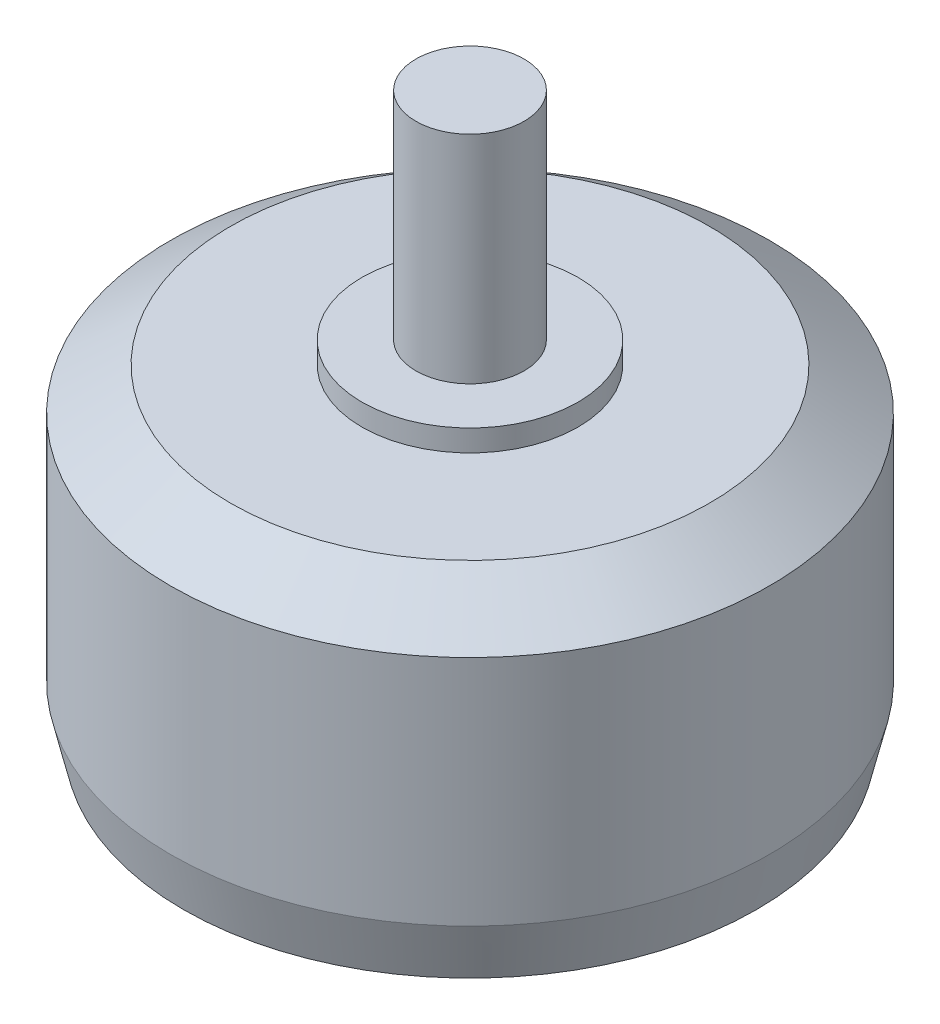
ISO-10303-21;
HEADER;
FILE_DESCRIPTION(('STEP AP214'),'2;1');
FILE_NAME('part.step','',(''),(''),'','','');
FILE_SCHEMA(('AUTOMOTIVE_DESIGN { 1 0 10303 214 1 1 1 1 }'));
ENDSEC;
DATA;
#1=APPLICATION_CONTEXT('core data for automotive mechanical design processes');
#2=APPLICATION_PROTOCOL_DEFINITION('international standard','automotive_design',2000,#1);
#3=PRODUCT_CONTEXT('',#1,'mechanical');
#4=PRODUCT('Part','Part','',(#3));
#5=PRODUCT_RELATED_PRODUCT_CATEGORY('part','',(#4));
#6=PRODUCT_DEFINITION_FORMATION('','',#4);
#7=PRODUCT_DEFINITION_CONTEXT('part definition',#1,'design');
#8=PRODUCT_DEFINITION('design','',#6,#7);
#9=PRODUCT_DEFINITION_SHAPE('','',#8);
#10=(LENGTH_UNIT() NAMED_UNIT(*) SI_UNIT(.MILLI.,.METRE.));
#11=(NAMED_UNIT(*) PLANE_ANGLE_UNIT() SI_UNIT($,.RADIAN.));
#12=(NAMED_UNIT(*) SI_UNIT($,.STERADIAN.) SOLID_ANGLE_UNIT());
#13=UNCERTAINTY_MEASURE_WITH_UNIT(LENGTH_MEASURE(1.E-05),#10,'distance_accuracy_value','');
#14=(GEOMETRIC_REPRESENTATION_CONTEXT(3) GLOBAL_UNCERTAINTY_ASSIGNED_CONTEXT((#13)) GLOBAL_UNIT_ASSIGNED_CONTEXT((#10,
#11,#12)) REPRESENTATION_CONTEXT('',''));
#15=CARTESIAN_POINT('',(0.,0.,0.));
#16=DIRECTION('',(0.,0.,1.));
#17=DIRECTION('',(1.,0.,0.));
#18=AXIS2_PLACEMENT_3D('',#15,#16,#17);
#19=CARTESIAN_POINT('',(0.,0.,0.));
#20=DIRECTION('',(0.,-1.,0.));
#21=DIRECTION('',(0.,0.,-1.));
#22=AXIS2_PLACEMENT_3D('',#19,#20,#21);
#23=PLANE('',#22);
#24=CARTESIAN_POINT('',(8.,0.,0.));
#25=DIRECTION('',(0.,-1.,0.));
#26=DIRECTION('',(0.,0.,-1.));
#27=AXIS2_PLACEMENT_3D('',#24,#25,#26);
#28=CIRCLE('',#27,1.);
#29=CARTESIAN_POINT('',(8.,0.,-1.));
#30=VERTEX_POINT('',#29);
#31=EDGE_CURVE('E97',#30,#30,#28,.T.);
#32=ORIENTED_EDGE('',*,*,#31,.F.);
#33=EDGE_LOOP('',(#32));
#34=FACE_BOUND('',#33,.T.);
#35=CARTESIAN_POINT('',(0.,0.,-6.));
#36=DIRECTION('',(0.,-1.,0.));
#37=DIRECTION('',(0.,0.,-1.));
#38=AXIS2_PLACEMENT_3D('',#35,#36,#37);
#39=CIRCLE('',#38,1.);
#40=CARTESIAN_POINT('',(0.,0.,-7.));
#41=VERTEX_POINT('',#40);
#42=EDGE_CURVE('E91',#41,#41,#39,.T.);
#43=ORIENTED_EDGE('',*,*,#42,.F.);
#44=EDGE_LOOP('',(#43));
#45=FACE_BOUND('',#44,.T.);
#46=CARTESIAN_POINT('',(-8.,0.,0.));
#47=DIRECTION('',(0.,-1.,0.));
#48=DIRECTION('',(0.,0.,-1.));
#49=AXIS2_PLACEMENT_3D('',#46,#47,#48);
#50=CIRCLE('',#49,1.);
#51=CARTESIAN_POINT('',(-8.,0.,-1.));
#52=VERTEX_POINT('',#51);
#53=EDGE_CURVE('E85',#52,#52,#50,.T.);
#54=ORIENTED_EDGE('',*,*,#53,.F.);
#55=EDGE_LOOP('',(#54));
#56=FACE_BOUND('',#55,.T.);
#57=CARTESIAN_POINT('',(0.,0.,6.));
#58=DIRECTION('',(0.,-1.,0.));
#59=DIRECTION('',(0.,0.,-1.));
#60=AXIS2_PLACEMENT_3D('',#57,#58,#59);
#61=CIRCLE('',#60,1.);
#62=CARTESIAN_POINT('',(0.,0.,5.));
#63=VERTEX_POINT('',#62);
#64=EDGE_CURVE('E79',#63,#63,#61,.T.);
#65=ORIENTED_EDGE('',*,*,#64,.F.);
#66=EDGE_LOOP('',(#65));
#67=FACE_BOUND('',#66,.T.);
#68=CARTESIAN_POINT('',(0.,0.,0.));
#69=DIRECTION('',(0.,1.,0.));
#70=DIRECTION('',(0.,0.,1.));
#71=AXIS2_PLACEMENT_3D('',#68,#69,#70);
#72=CIRCLE('',#71,13.2572796826854);
#73=CARTESIAN_POINT('',(0.,0.,13.2572796826854));
#74=VERTEX_POINT('',#73);
#75=EDGE_CURVE('E12',#74,#74,#72,.T.);
#76=ORIENTED_EDGE('',*,*,#75,.F.);
#77=EDGE_LOOP('',(#76));
#78=FACE_BOUND('',#77,.T.);
#79=ADVANCED_FACE('F47',(#34,#45,#56,#67,#78),#23,.T.);
#80=CARTESIAN_POINT('',(0.,2.5035491111513,0.));
#81=DIRECTION('',(0.,1.,0.));
#82=DIRECTION('',(0.,0.,1.));
#83=AXIS2_PLACEMENT_3D('',#80,#81,#82);
#84=CONICAL_SURFACE('',#83,13.85,0.23247164273145);
#85=ORIENTED_EDGE('',*,*,#75,.T.);
#86=EDGE_LOOP('',(#85));
#87=FACE_BOUND('',#86,.T.);
#88=CARTESIAN_POINT('',(0.,2.5035491111513,0.));
#89=DIRECTION('',(0.,1.,0.));
#90=DIRECTION('',(0.,0.,1.));
#91=AXIS2_PLACEMENT_3D('',#88,#89,#90);
#92=CIRCLE('',#91,13.85);
#93=CARTESIAN_POINT('',(0.,2.5035491111513,13.85));
#94=VERTEX_POINT('',#93);
#95=EDGE_CURVE('E53',#94,#94,#92,.T.);
#96=ORIENTED_EDGE('',*,*,#95,.F.);
#97=EDGE_LOOP('',(#96));
#98=FACE_BOUND('',#97,.T.);
#99=ADVANCED_FACE('F114',(#87,#98),#84,.T.);
#100=CARTESIAN_POINT('',(0.,26.2,0.));
#101=DIRECTION('',(0.,1.,0.));
#102=DIRECTION('',(0.,0.,1.));
#103=AXIS2_PLACEMENT_3D('',#100,#101,#102);
#104=CYLINDRICAL_SURFACE('',#103,13.85);
#105=ORIENTED_EDGE('',*,*,#95,.T.);
#106=EDGE_LOOP('',(#105));
#107=FACE_BOUND('',#106,.T.);
#108=CARTESIAN_POINT('',(0.,13.2610633285044,0.));
#109=DIRECTION('',(0.,1.,0.));
#110=DIRECTION('',(0.,0.,1.));
#111=AXIS2_PLACEMENT_3D('',#108,#109,#110);
#112=CIRCLE('',#111,13.85);
#113=CARTESIAN_POINT('',(0.,13.2610633285044,13.85));
#114=VERTEX_POINT('',#113);
#115=EDGE_CURVE('E57',#114,#114,#112,.T.);
#116=ORIENTED_EDGE('',*,*,#115,.F.);
#117=EDGE_LOOP('',(#116));
#118=FACE_BOUND('',#117,.T.);
#119=ADVANCED_FACE('F159',(#107,#118),#104,.T.);
#120=CARTESIAN_POINT('',(0.,15.2,0.));
#121=DIRECTION('',(0.,-1.,0.));
#122=DIRECTION('',(0.,0.,-1.));
#123=AXIS2_PLACEMENT_3D('',#120,#121,#122);
#124=CONICAL_SURFACE('',#123,11.0869417310102,0.958906402302683);
#125=ORIENTED_EDGE('',*,*,#115,.T.);
#126=EDGE_LOOP('',(#125));
#127=FACE_BOUND('',#126,.T.);
#128=CARTESIAN_POINT('',(0.,15.2,0.));
#129=DIRECTION('',(0.,1.,0.));
#130=DIRECTION('',(0.,0.,1.));
#131=AXIS2_PLACEMENT_3D('',#128,#129,#130);
#132=CIRCLE('',#131,11.0869417310102);
#133=CARTESIAN_POINT('',(0.,15.2,11.0869417310102));
#134=VERTEX_POINT('',#133);
#135=EDGE_CURVE('E61',#134,#134,#132,.T.);
#136=ORIENTED_EDGE('',*,*,#135,.F.);
#137=EDGE_LOOP('',(#136));
#138=FACE_BOUND('',#137,.T.);
#139=ADVANCED_FACE('F155',(#127,#138),#124,.T.);
#140=CARTESIAN_POINT('',(0.,15.2,11.0869417310102));
#141=DIRECTION('',(0.,1.,0.));
#142=DIRECTION('',(0.,0.,1.));
#143=AXIS2_PLACEMENT_3D('',#140,#141,#142);
#144=PLANE('',#143);
#145=ORIENTED_EDGE('',*,*,#135,.T.);
#146=EDGE_LOOP('',(#145));
#147=FACE_BOUND('',#146,.T.);
#148=CARTESIAN_POINT('',(0.,15.2,0.));
#149=DIRECTION('',(0.,1.,0.));
#150=DIRECTION('',(0.,0.,1.));
#151=AXIS2_PLACEMENT_3D('',#148,#149,#150);
#152=CIRCLE('',#151,5.);
#153=CARTESIAN_POINT('',(0.,15.2,5.));
#154=VERTEX_POINT('',#153);
#155=EDGE_CURVE('E66',#154,#154,#152,.T.);
#156=ORIENTED_EDGE('',*,*,#155,.F.);
#157=EDGE_LOOP('',(#156));
#158=FACE_BOUND('',#157,.T.);
#159=ADVANCED_FACE('F151',(#147,#158),#144,.T.);
#160=CARTESIAN_POINT('',(0.,26.2,0.));
#161=DIRECTION('',(0.,1.,0.));
#162=DIRECTION('',(0.,0.,1.));
#163=AXIS2_PLACEMENT_3D('',#160,#161,#162);
#164=CYLINDRICAL_SURFACE('',#163,5.);
#165=ORIENTED_EDGE('',*,*,#155,.T.);
#166=EDGE_LOOP('',(#165));
#167=FACE_BOUND('',#166,.T.);
#168=CARTESIAN_POINT('',(0.,16.2,0.));
#169=DIRECTION('',(0.,1.,0.));
#170=DIRECTION('',(0.,0.,1.));
#171=AXIS2_PLACEMENT_3D('',#168,#169,#170);
#172=CIRCLE('',#171,5.);
#173=CARTESIAN_POINT('',(0.,16.2,5.));
#174=VERTEX_POINT('',#173);
#175=EDGE_CURVE('E69',#174,#174,#172,.T.);
#176=ORIENTED_EDGE('',*,*,#175,.F.);
#177=EDGE_LOOP('',(#176));
#178=FACE_BOUND('',#177,.T.);
#179=ADVANCED_FACE('F147',(#167,#178),#164,.T.);
#180=CARTESIAN_POINT('',(0.,16.2,5.));
#181=DIRECTION('',(0.,1.,0.));
#182=DIRECTION('',(0.,0.,1.));
#183=AXIS2_PLACEMENT_3D('',#180,#181,#182);
#184=PLANE('',#183);
#185=ORIENTED_EDGE('',*,*,#175,.T.);
#186=EDGE_LOOP('',(#185));
#187=FACE_BOUND('',#186,.T.);
#188=CARTESIAN_POINT('',(0.,16.2,0.));
#189=DIRECTION('',(0.,1.,0.));
#190=DIRECTION('',(0.,0.,1.));
#191=AXIS2_PLACEMENT_3D('',#188,#189,#190);
#192=CIRCLE('',#191,2.5);
#193=CARTESIAN_POINT('',(0.,16.2,2.5));
#194=VERTEX_POINT('',#193);
#195=EDGE_CURVE('E72',#194,#194,#192,.T.);
#196=ORIENTED_EDGE('',*,*,#195,.F.);
#197=EDGE_LOOP('',(#196));
#198=FACE_BOUND('',#197,.T.);
#199=ADVANCED_FACE('F143',(#187,#198),#184,.T.);
#200=CARTESIAN_POINT('',(0.,26.2,0.));
#201=DIRECTION('',(0.,1.,0.));
#202=DIRECTION('',(0.,0.,1.));
#203=AXIS2_PLACEMENT_3D('',#200,#201,#202);
#204=CYLINDRICAL_SURFACE('',#203,2.5);
#205=ORIENTED_EDGE('',*,*,#195,.T.);
#206=EDGE_LOOP('',(#205));
#207=FACE_BOUND('',#206,.T.);
#208=CARTESIAN_POINT('',(0.,26.2,0.));
#209=DIRECTION('',(0.,1.,0.));
#210=DIRECTION('',(0.,0.,1.));
#211=AXIS2_PLACEMENT_3D('',#208,#209,#210);
#212=CIRCLE('',#211,2.5);
#213=CARTESIAN_POINT('',(0.,26.2,2.5));
#214=VERTEX_POINT('',#213);
#215=EDGE_CURVE('E75',#214,#214,#212,.T.);
#216=ORIENTED_EDGE('',*,*,#215,.F.);
#217=EDGE_LOOP('',(#216));
#218=FACE_BOUND('',#217,.T.);
#219=ADVANCED_FACE('F135',(#207,#218),#204,.T.);
#220=CARTESIAN_POINT('',(0.,26.2,2.5));
#221=DIRECTION('',(0.,1.,0.));
#222=DIRECTION('',(0.,0.,1.));
#223=AXIS2_PLACEMENT_3D('',#220,#221,#222);
#224=PLANE('',#223);
#225=ORIENTED_EDGE('',*,*,#215,.T.);
#226=EDGE_LOOP('',(#225));
#227=FACE_BOUND('',#226,.T.);
#228=ADVANCED_FACE('F125',(#227),#224,.T.);
#229=CARTESIAN_POINT('',(0.,10.16,6.));
#230=DIRECTION('',(0.,-1.,0.));
#231=DIRECTION('',(0.,0.,-1.));
#232=AXIS2_PLACEMENT_3D('',#229,#230,#231);
#233=CYLINDRICAL_SURFACE('',#232,1.);
#234=CARTESIAN_POINT('',(0.,10.16,6.));
#235=DIRECTION('',(0.,-1.,0.));
#236=DIRECTION('',(0.,0.,-1.));
#237=AXIS2_PLACEMENT_3D('',#234,#235,#236);
#238=CIRCLE('',#237,1.);
#239=CARTESIAN_POINT('',(0.,10.16,5.));
#240=VERTEX_POINT('',#239);
#241=EDGE_CURVE('E78',#240,#240,#238,.T.);
#242=ORIENTED_EDGE('',*,*,#241,.F.);
#243=EDGE_LOOP('',(#242));
#244=FACE_BOUND('',#243,.T.);
#245=ORIENTED_EDGE('',*,*,#64,.T.);
#246=EDGE_LOOP('',(#245));
#247=FACE_BOUND('',#246,.T.);
#248=ADVANCED_FACE('F122',(#244,#247),#233,.F.);
#249=CARTESIAN_POINT('',(0.,10.16,6.));
#250=DIRECTION('',(0.,-1.,0.));
#251=DIRECTION('',(0.,0.,-1.));
#252=AXIS2_PLACEMENT_3D('',#249,#250,#251);
#253=PLANE('',#252);
#254=ORIENTED_EDGE('',*,*,#241,.T.);
#255=EDGE_LOOP('',(#254));
#256=FACE_BOUND('',#255,.T.);
#257=ADVANCED_FACE('F124',(#256),#253,.T.);
#258=CARTESIAN_POINT('',(-8.,10.16,0.));
#259=DIRECTION('',(0.,-1.,0.));
#260=DIRECTION('',(0.,0.,-1.));
#261=AXIS2_PLACEMENT_3D('',#258,#259,#260);
#262=CYLINDRICAL_SURFACE('',#261,1.);
#263=CARTESIAN_POINT('',(-8.,10.16,0.));
#264=DIRECTION('',(0.,-1.,0.));
#265=DIRECTION('',(0.,0.,-1.));
#266=AXIS2_PLACEMENT_3D('',#263,#264,#265);
#267=CIRCLE('',#266,1.);
#268=CARTESIAN_POINT('',(-8.,10.16,-0.999999999999999));
#269=VERTEX_POINT('',#268);
#270=EDGE_CURVE('E88',#269,#269,#267,.T.);
#271=ORIENTED_EDGE('',*,*,#270,.F.);
#272=EDGE_LOOP('',(#271));
#273=FACE_BOUND('',#272,.T.);
#274=ORIENTED_EDGE('',*,*,#53,.T.);
#275=EDGE_LOOP('',(#274));
#276=FACE_BOUND('',#275,.T.);
#277=ADVANCED_FACE('F132',(#273,#276),#262,.F.);
#278=CARTESIAN_POINT('',(-8.,10.16,0.));
#279=DIRECTION('',(0.,-1.,0.));
#280=DIRECTION('',(0.,0.,-1.));
#281=AXIS2_PLACEMENT_3D('',#278,#279,#280);
#282=PLANE('',#281);
#283=ORIENTED_EDGE('',*,*,#270,.T.);
#284=EDGE_LOOP('',(#283));
#285=FACE_BOUND('',#284,.T.);
#286=ADVANCED_FACE('F219',(#285),#282,.T.);
#287=CARTESIAN_POINT('',(0.,10.16,-6.));
#288=DIRECTION('',(0.,-1.,0.));
#289=DIRECTION('',(0.,0.,-1.));
#290=AXIS2_PLACEMENT_3D('',#287,#288,#289);
#291=CYLINDRICAL_SURFACE('',#290,1.);
#292=CARTESIAN_POINT('',(0.,10.16,-6.));
#293=DIRECTION('',(0.,-1.,0.));
#294=DIRECTION('',(0.,0.,-1.));
#295=AXIS2_PLACEMENT_3D('',#292,#293,#294);
#296=CIRCLE('',#295,1.);
#297=CARTESIAN_POINT('',(0.,10.16,-7.));
#298=VERTEX_POINT('',#297);
#299=EDGE_CURVE('E94',#298,#298,#296,.T.);
#300=ORIENTED_EDGE('',*,*,#299,.F.);
#301=EDGE_LOOP('',(#300));
#302=FACE_BOUND('',#301,.T.);
#303=ORIENTED_EDGE('',*,*,#42,.T.);
#304=EDGE_LOOP('',(#303));
#305=FACE_BOUND('',#304,.T.);
#306=ADVANCED_FACE('F228',(#302,#305),#291,.F.);
#307=CARTESIAN_POINT('',(0.,10.16,-6.));
#308=DIRECTION('',(0.,-1.,0.));
#309=DIRECTION('',(0.,0.,-1.));
#310=AXIS2_PLACEMENT_3D('',#307,#308,#309);
#311=PLANE('',#310);
#312=ORIENTED_EDGE('',*,*,#299,.T.);
#313=EDGE_LOOP('',(#312));
#314=FACE_BOUND('',#313,.T.);
#315=ADVANCED_FACE('F108',(#314),#311,.T.);
#316=CARTESIAN_POINT('',(8.,10.16,0.));
#317=DIRECTION('',(0.,-1.,0.));
#318=DIRECTION('',(0.,0.,-1.));
#319=AXIS2_PLACEMENT_3D('',#316,#317,#318);
#320=CYLINDRICAL_SURFACE('',#319,1.);
#321=CARTESIAN_POINT('',(8.,10.16,0.));
#322=DIRECTION('',(0.,-1.,0.));
#323=DIRECTION('',(0.,0.,-1.));
#324=AXIS2_PLACEMENT_3D('',#321,#322,#323);
#325=CIRCLE('',#324,1.);
#326=CARTESIAN_POINT('',(8.,10.16,-1.));
#327=VERTEX_POINT('',#326);
#328=EDGE_CURVE('E82',#327,#327,#325,.T.);
#329=ORIENTED_EDGE('',*,*,#328,.F.);
#330=EDGE_LOOP('',(#329));
#331=FACE_BOUND('',#330,.T.);
#332=ORIENTED_EDGE('',*,*,#31,.T.);
#333=EDGE_LOOP('',(#332));
#334=FACE_BOUND('',#333,.T.);
#335=ADVANCED_FACE('F105',(#331,#334),#320,.F.);
#336=CARTESIAN_POINT('',(8.,10.16,0.));
#337=DIRECTION('',(0.,-1.,0.));
#338=DIRECTION('',(0.,0.,-1.));
#339=AXIS2_PLACEMENT_3D('',#336,#337,#338);
#340=PLANE('',#339);
#341=ORIENTED_EDGE('',*,*,#328,.T.);
#342=EDGE_LOOP('',(#341));
#343=FACE_BOUND('',#342,.T.);
#344=ADVANCED_FACE('F103',(#343),#340,.T.);
#345=CLOSED_SHELL('',(#79,#99,#119,#139,#159,#179,#199,#219,#228,#248,#257,#277,#286,#306,#315,
#335,#344));
#346=MANIFOLD_SOLID_BREP('B2',#345);
#347=ADVANCED_BREP_SHAPE_REPRESENTATION('',(#18,#346),#14);
#348=SHAPE_DEFINITION_REPRESENTATION(#9,#347);
ENDSEC;
END-ISO-10303-21;
